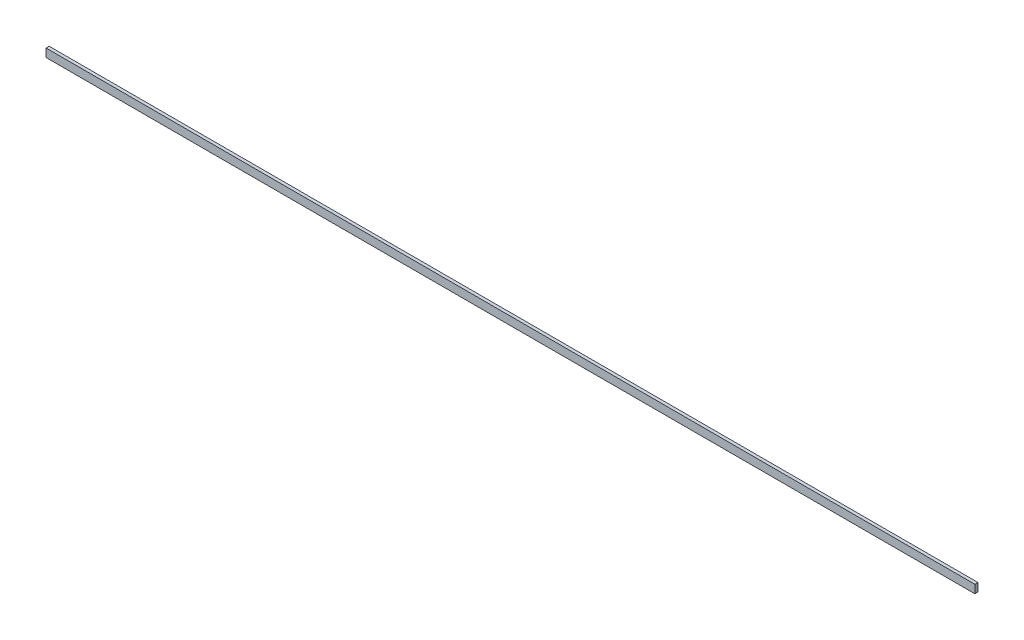
ISO-10303-21;
HEADER;
FILE_DESCRIPTION(('STEP AP214'),'2;1');
FILE_NAME('part.step','',(''),(''),'','','');
FILE_SCHEMA(('AUTOMOTIVE_DESIGN { 1 0 10303 214 1 1 1 1 }'));
ENDSEC;
DATA;
#1=APPLICATION_CONTEXT('core data for automotive mechanical design processes');
#2=APPLICATION_PROTOCOL_DEFINITION('international standard','automotive_design',2000,#1);
#3=PRODUCT_CONTEXT('',#1,'mechanical');
#4=PRODUCT('Part','Part','',(#3));
#5=PRODUCT_RELATED_PRODUCT_CATEGORY('part','',(#4));
#6=PRODUCT_DEFINITION_FORMATION('','',#4);
#7=PRODUCT_DEFINITION_CONTEXT('part definition',#1,'design');
#8=PRODUCT_DEFINITION('design','',#6,#7);
#9=PRODUCT_DEFINITION_SHAPE('','',#8);
#10=(LENGTH_UNIT() NAMED_UNIT(*) SI_UNIT(.MILLI.,.METRE.));
#11=(NAMED_UNIT(*) PLANE_ANGLE_UNIT() SI_UNIT($,.RADIAN.));
#12=(NAMED_UNIT(*) SI_UNIT($,.STERADIAN.) SOLID_ANGLE_UNIT());
#13=UNCERTAINTY_MEASURE_WITH_UNIT(LENGTH_MEASURE(1.E-05),#10,'distance_accuracy_value','');
#14=(GEOMETRIC_REPRESENTATION_CONTEXT(3) GLOBAL_UNCERTAINTY_ASSIGNED_CONTEXT((#13)) GLOBAL_UNIT_ASSIGNED_CONTEXT((#10,
#11,#12)) REPRESENTATION_CONTEXT('',''));
#15=CARTESIAN_POINT('',(0.,0.,0.));
#16=DIRECTION('',(0.,0.,1.));
#17=DIRECTION('',(1.,0.,0.));
#18=AXIS2_PLACEMENT_3D('',#15,#16,#17);
#19=CARTESIAN_POINT('',(450.000000000001,-3.99999999999995,1.5));
#20=DIRECTION('',(-1.,0.,0.));
#21=DIRECTION('',(0.,0.,1.));
#22=AXIS2_PLACEMENT_3D('',#19,#20,#21);
#23=PLANE('',#22);
#24=DIRECTION('',(0.,1.,0.));
#25=VECTOR('',#24,1.);
#26=CARTESIAN_POINT('',(450.000000000001,-3.99999999999995,-1.5));
#27=LINE('',#26,#25);
#28=CARTESIAN_POINT('',(450.000000000001,-3.99999999999995,-1.5));
#29=VERTEX_POINT('',#28);
#30=CARTESIAN_POINT('',(450.000000000001,4.00000000000003,-1.5));
#31=VERTEX_POINT('',#30);
#32=EDGE_CURVE('E96',#29,#31,#27,.T.);
#33=ORIENTED_EDGE('',*,*,#32,.T.);
#34=DIRECTION('',(0.,0.,-1.));
#35=VECTOR('',#34,1.);
#36=CARTESIAN_POINT('',(450.000000000001,4.00000000000003,1.5));
#37=LINE('',#36,#35);
#38=CARTESIAN_POINT('',(450.000000000001,4.00000000000003,1.5));
#39=VERTEX_POINT('',#38);
#40=EDGE_CURVE('E11',#39,#31,#37,.T.);
#41=ORIENTED_EDGE('',*,*,#40,.F.);
#42=DIRECTION('',(0.,1.,0.));
#43=VECTOR('',#42,1.);
#44=CARTESIAN_POINT('',(450.000000000001,-3.99999999999995,1.5));
#45=LINE('',#44,#43);
#46=CARTESIAN_POINT('',(450.000000000001,-3.99999999999995,1.5));
#47=VERTEX_POINT('',#46);
#48=EDGE_CURVE('E84',#47,#39,#45,.T.);
#49=ORIENTED_EDGE('',*,*,#48,.F.);
#50=DIRECTION('',(0.,0.,-1.));
#51=VECTOR('',#50,1.);
#52=CARTESIAN_POINT('',(450.000000000001,-3.99999999999995,1.5));
#53=LINE('',#52,#51);
#54=EDGE_CURVE('E92',#47,#29,#53,.T.);
#55=ORIENTED_EDGE('',*,*,#54,.T.);
#56=EDGE_LOOP('',(#33,#41,#49,#55));
#57=FACE_BOUND('',#56,.T.);
#58=ADVANCED_FACE('F33',(#57),#23,.F.);
#59=CARTESIAN_POINT('',(-449.999999999999,4.00000000000003,1.5));
#60=DIRECTION('',(0.,-1.,0.));
#61=DIRECTION('',(0.,0.,-1.));
#62=AXIS2_PLACEMENT_3D('',#59,#60,#61);
#63=PLANE('',#62);
#64=DIRECTION('',(-1.,0.,0.));
#65=VECTOR('',#64,1.);
#66=CARTESIAN_POINT('',(-449.999999999999,4.00000000000003,-1.5));
#67=LINE('',#66,#65);
#68=CARTESIAN_POINT('',(-449.999999999999,4.00000000000003,-1.5));
#69=VERTEX_POINT('',#68);
#70=EDGE_CURVE('E88',#31,#69,#67,.T.);
#71=ORIENTED_EDGE('',*,*,#70,.T.);
#72=DIRECTION('',(0.,0.,-1.));
#73=VECTOR('',#72,1.);
#74=CARTESIAN_POINT('',(-449.999999999999,4.00000000000003,1.5));
#75=LINE('',#74,#73);
#76=CARTESIAN_POINT('',(-449.999999999999,4.00000000000003,1.5));
#77=VERTEX_POINT('',#76);
#78=EDGE_CURVE('E41',#77,#69,#75,.T.);
#79=ORIENTED_EDGE('',*,*,#78,.F.);
#80=DIRECTION('',(-1.,0.,0.));
#81=VECTOR('',#80,1.);
#82=CARTESIAN_POINT('',(-449.999999999999,4.00000000000003,1.5));
#83=LINE('',#82,#81);
#84=EDGE_CURVE('E79',#39,#77,#83,.T.);
#85=ORIENTED_EDGE('',*,*,#84,.F.);
#86=ORIENTED_EDGE('',*,*,#40,.T.);
#87=EDGE_LOOP('',(#71,#79,#85,#86));
#88=FACE_BOUND('',#87,.T.);
#89=ADVANCED_FACE('F87',(#88),#63,.F.);
#90=CARTESIAN_POINT('',(-449.999999999999,-3.99999999999995,1.5));
#91=DIRECTION('',(1.,0.,0.));
#92=DIRECTION('',(0.,0.,-1.));
#93=AXIS2_PLACEMENT_3D('',#90,#91,#92);
#94=PLANE('',#93);
#95=DIRECTION('',(0.,-1.,0.));
#96=VECTOR('',#95,1.);
#97=CARTESIAN_POINT('',(-449.999999999999,-3.99999999999995,-1.5));
#98=LINE('',#97,#96);
#99=CARTESIAN_POINT('',(-449.999999999999,-3.99999999999995,-1.5));
#100=VERTEX_POINT('',#99);
#101=EDGE_CURVE('E66',#69,#100,#98,.T.);
#102=ORIENTED_EDGE('',*,*,#101,.T.);
#103=DIRECTION('',(0.,0.,-1.));
#104=VECTOR('',#103,1.);
#105=CARTESIAN_POINT('',(-449.999999999999,-3.99999999999995,1.5));
#106=LINE('',#105,#104);
#107=CARTESIAN_POINT('',(-449.999999999999,-3.99999999999995,1.5));
#108=VERTEX_POINT('',#107);
#109=EDGE_CURVE('E89',#108,#100,#106,.T.);
#110=ORIENTED_EDGE('',*,*,#109,.F.);
#111=DIRECTION('',(0.,-1.,0.));
#112=VECTOR('',#111,1.);
#113=CARTESIAN_POINT('',(-449.999999999999,-3.99999999999995,1.5));
#114=LINE('',#113,#112);
#115=EDGE_CURVE('E82',#77,#108,#114,.T.);
#116=ORIENTED_EDGE('',*,*,#115,.F.);
#117=ORIENTED_EDGE('',*,*,#78,.T.);
#118=EDGE_LOOP('',(#102,#110,#116,#117));
#119=FACE_BOUND('',#118,.T.);
#120=ADVANCED_FACE('F90',(#119),#94,.F.);
#121=CARTESIAN_POINT('',(-449.999999999999,-3.99999999999995,1.5));
#122=DIRECTION('',(0.,1.,0.));
#123=DIRECTION('',(0.,0.,1.));
#124=AXIS2_PLACEMENT_3D('',#121,#122,#123);
#125=PLANE('',#124);
#126=DIRECTION('',(1.,0.,0.));
#127=VECTOR('',#126,1.);
#128=CARTESIAN_POINT('',(-449.999999999999,-3.99999999999995,-1.5));
#129=LINE('',#128,#127);
#130=EDGE_CURVE('E72',#100,#29,#129,.T.);
#131=ORIENTED_EDGE('',*,*,#130,.T.);
#132=ORIENTED_EDGE('',*,*,#54,.F.);
#133=DIRECTION('',(1.,0.,0.));
#134=VECTOR('',#133,1.);
#135=CARTESIAN_POINT('',(-449.999999999999,-3.99999999999995,1.5));
#136=LINE('',#135,#134);
#137=EDGE_CURVE('E49',#108,#47,#136,.T.);
#138=ORIENTED_EDGE('',*,*,#137,.F.);
#139=ORIENTED_EDGE('',*,*,#109,.T.);
#140=EDGE_LOOP('',(#131,#132,#138,#139));
#141=FACE_BOUND('',#140,.T.);
#142=ADVANCED_FACE('F103',(#141),#125,.F.);
#143=CARTESIAN_POINT('',(0.,0.,1.5));
#144=DIRECTION('',(0.,0.,-1.));
#145=DIRECTION('',(-1.,0.,0.));
#146=AXIS2_PLACEMENT_3D('',#143,#144,#145);
#147=PLANE('',#146);
#148=ORIENTED_EDGE('',*,*,#48,.T.);
#149=ORIENTED_EDGE('',*,*,#84,.T.);
#150=ORIENTED_EDGE('',*,*,#115,.T.);
#151=ORIENTED_EDGE('',*,*,#137,.T.);
#152=EDGE_LOOP('',(#148,#149,#150,#151));
#153=FACE_BOUND('',#152,.T.);
#154=ADVANCED_FACE('F80',(#153),#147,.F.);
#155=CARTESIAN_POINT('',(0.,0.,-1.5));
#156=DIRECTION('',(0.,0.,-1.));
#157=DIRECTION('',(-1.,0.,0.));
#158=AXIS2_PLACEMENT_3D('',#155,#156,#157);
#159=PLANE('',#158);
#160=ORIENTED_EDGE('',*,*,#32,.F.);
#161=ORIENTED_EDGE('',*,*,#130,.F.);
#162=ORIENTED_EDGE('',*,*,#101,.F.);
#163=ORIENTED_EDGE('',*,*,#70,.F.);
#164=EDGE_LOOP('',(#160,#161,#162,#163));
#165=FACE_BOUND('',#164,.T.);
#166=ADVANCED_FACE('F106',(#165),#159,.T.);
#167=CLOSED_SHELL('',(#58,#89,#120,#142,#154,#166));
#168=MANIFOLD_SOLID_BREP('B2',#167);
#169=ADVANCED_BREP_SHAPE_REPRESENTATION('',(#18,#168),#14);
#170=SHAPE_DEFINITION_REPRESENTATION(#9,#169);
ENDSEC;
END-ISO-10303-21;
